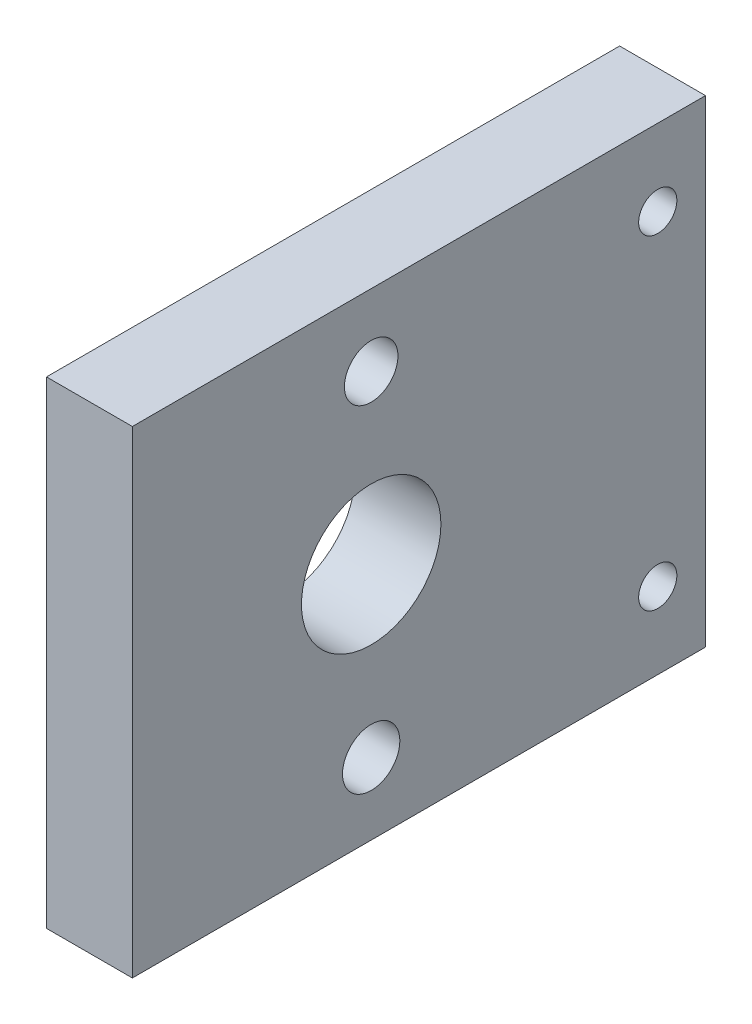
ISO-10303-21;
HEADER;
FILE_DESCRIPTION(('STEP AP214'),'2;1');
FILE_NAME('part.step','',(''),(''),'','','');
FILE_SCHEMA(('AUTOMOTIVE_DESIGN { 1 0 10303 214 1 1 1 1 }'));
ENDSEC;
DATA;
#1=APPLICATION_CONTEXT('core data for automotive mechanical design processes');
#2=APPLICATION_PROTOCOL_DEFINITION('international standard','automotive_design',2000,#1);
#3=PRODUCT_CONTEXT('',#1,'mechanical');
#4=PRODUCT('Part','Part','',(#3));
#5=PRODUCT_RELATED_PRODUCT_CATEGORY('part','',(#4));
#6=PRODUCT_DEFINITION_FORMATION('','',#4);
#7=PRODUCT_DEFINITION_CONTEXT('part definition',#1,'design');
#8=PRODUCT_DEFINITION('design','',#6,#7);
#9=PRODUCT_DEFINITION_SHAPE('','',#8);
#10=(LENGTH_UNIT() NAMED_UNIT(*) SI_UNIT(.MILLI.,.METRE.));
#11=(NAMED_UNIT(*) PLANE_ANGLE_UNIT() SI_UNIT($,.RADIAN.));
#12=(NAMED_UNIT(*) SI_UNIT($,.STERADIAN.) SOLID_ANGLE_UNIT());
#13=UNCERTAINTY_MEASURE_WITH_UNIT(LENGTH_MEASURE(1.E-05),#10,'distance_accuracy_value','');
#14=(GEOMETRIC_REPRESENTATION_CONTEXT(3) GLOBAL_UNCERTAINTY_ASSIGNED_CONTEXT((#13)) GLOBAL_UNIT_ASSIGNED_CONTEXT((#10,
#11,#12)) REPRESENTATION_CONTEXT('',''));
#15=CARTESIAN_POINT('',(0.,0.,0.));
#16=DIRECTION('',(0.,0.,1.));
#17=DIRECTION('',(1.,0.,0.));
#18=AXIS2_PLACEMENT_3D('',#15,#16,#17);
#19=CARTESIAN_POINT('',(-52.810925728328,50.4855029585799,0.));
#20=DIRECTION('',(-1.,0.,0.));
#21=DIRECTION('',(0.,0.,1.));
#22=AXIS2_PLACEMENT_3D('',#19,#20,#21);
#23=PLANE('',#22);
#24=CARTESIAN_POINT('',(-52.810925728328,29.2355029585799,17.5));
#25=DIRECTION('',(-1.,0.,0.));
#26=DIRECTION('',(0.,0.,1.));
#27=AXIS2_PLACEMENT_3D('',#24,#25,#26);
#28=CIRCLE('',#27,1.5);
#29=CARTESIAN_POINT('',(-52.810925728328,29.2355029585799,19.));
#30=VERTEX_POINT('',#29);
#31=EDGE_CURVE('E130',#30,#30,#28,.T.);
#32=ORIENTED_EDGE('',*,*,#31,.F.);
#33=EDGE_LOOP('',(#32));
#34=FACE_BOUND('',#33,.T.);
#35=CARTESIAN_POINT('',(-52.810925728328,46.7355029585799,17.5));
#36=DIRECTION('',(-1.,0.,0.));
#37=DIRECTION('',(0.,0.,1.));
#38=AXIS2_PLACEMENT_3D('',#35,#36,#37);
#39=CIRCLE('',#38,1.4);
#40=CARTESIAN_POINT('',(-52.810925728328,46.7355029585799,18.9));
#41=VERTEX_POINT('',#40);
#42=EDGE_CURVE('E119',#41,#41,#39,.T.);
#43=ORIENTED_EDGE('',*,*,#42,.F.);
#44=EDGE_LOOP('',(#43));
#45=FACE_BOUND('',#44,.T.);
#46=CARTESIAN_POINT('',(-52.810925728328,37.9855029585799,17.5));
#47=DIRECTION('',(-1.,0.,0.));
#48=DIRECTION('',(0.,0.,1.));
#49=AXIS2_PLACEMENT_3D('',#46,#47,#48);
#50=CIRCLE('',#49,3.65);
#51=CARTESIAN_POINT('',(-52.810925728328,37.9855029585799,21.15));
#52=VERTEX_POINT('',#51);
#53=EDGE_CURVE('E123',#52,#52,#50,.T.);
#54=ORIENTED_EDGE('',*,*,#53,.F.);
#55=EDGE_LOOP('',(#54));
#56=FACE_BOUND('',#55,.T.);
#57=CARTESIAN_POINT('',(-52.810925728328,29.4855029585799,2.5));
#58=DIRECTION('',(-1.,0.,0.));
#59=DIRECTION('',(0.,0.,1.));
#60=AXIS2_PLACEMENT_3D('',#57,#58,#59);
#61=CIRCLE('',#60,1.);
#62=CARTESIAN_POINT('',(-52.810925728328,29.4855029585799,3.5));
#63=VERTEX_POINT('',#62);
#64=EDGE_CURVE('E115',#63,#63,#61,.T.);
#65=ORIENTED_EDGE('',*,*,#64,.F.);
#66=EDGE_LOOP('',(#65));
#67=FACE_BOUND('',#66,.T.);
#68=CARTESIAN_POINT('',(-52.810925728328,46.4855029585799,2.5));
#69=DIRECTION('',(-1.,0.,0.));
#70=DIRECTION('',(0.,0.,1.));
#71=AXIS2_PLACEMENT_3D('',#68,#69,#70);
#72=CIRCLE('',#71,1.);
#73=CARTESIAN_POINT('',(-52.810925728328,46.4855029585799,3.5));
#74=VERTEX_POINT('',#73);
#75=EDGE_CURVE('E98',#74,#74,#72,.T.);
#76=ORIENTED_EDGE('',*,*,#75,.F.);
#77=EDGE_LOOP('',(#76));
#78=FACE_BOUND('',#77,.T.);
#79=DIRECTION('',(0.,0.,1.));
#80=VECTOR('',#79,1.);
#81=CARTESIAN_POINT('',(-52.810925728328,25.4855029585799,0.));
#82=LINE('',#81,#80);
#83=CARTESIAN_POINT('',(-52.810925728328,25.4855029585799,0.));
#84=VERTEX_POINT('',#83);
#85=CARTESIAN_POINT('',(-52.810925728328,25.4855029585799,30.));
#86=VERTEX_POINT('',#85);
#87=EDGE_CURVE('E73',#84,#86,#82,.T.);
#88=ORIENTED_EDGE('',*,*,#87,.T.);
#89=DIRECTION('',(0.,-1.,0.));
#90=VECTOR('',#89,1.);
#91=CARTESIAN_POINT('',(-52.810925728328,50.4855029585799,30.));
#92=LINE('',#91,#90);
#93=CARTESIAN_POINT('',(-52.810925728328,50.4855029585799,30.));
#94=VERTEX_POINT('',#93);
#95=EDGE_CURVE('E76',#94,#86,#92,.T.);
#96=ORIENTED_EDGE('',*,*,#95,.F.);
#97=DIRECTION('',(0.,0.,1.));
#98=VECTOR('',#97,1.);
#99=CARTESIAN_POINT('',(-52.810925728328,50.4855029585799,0.));
#100=LINE('',#99,#98);
#101=CARTESIAN_POINT('',(-52.810925728328,50.4855029585799,0.));
#102=VERTEX_POINT('',#101);
#103=EDGE_CURVE('E11',#102,#94,#100,.T.);
#104=ORIENTED_EDGE('',*,*,#103,.F.);
#105=DIRECTION('',(0.,-1.,0.));
#106=VECTOR('',#105,1.);
#107=CARTESIAN_POINT('',(-52.810925728328,50.4855029585799,0.));
#108=LINE('',#107,#106);
#109=EDGE_CURVE('E77',#102,#84,#108,.T.);
#110=ORIENTED_EDGE('',*,*,#109,.T.);
#111=EDGE_LOOP('',(#88,#96,#104,#110));
#112=FACE_BOUND('',#111,.T.);
#113=ADVANCED_FACE('F35',(#34,#45,#56,#67,#78,#112),#23,.T.);
#114=CARTESIAN_POINT('',(-52.810925728328,50.4855029585799,0.));
#115=DIRECTION('',(0.,1.,0.));
#116=DIRECTION('',(0.,0.,1.));
#117=AXIS2_PLACEMENT_3D('',#114,#115,#116);
#118=PLANE('',#117);
#119=ORIENTED_EDGE('',*,*,#103,.T.);
#120=DIRECTION('',(-1.,0.,0.));
#121=VECTOR('',#120,1.);
#122=CARTESIAN_POINT('',(-52.810925728328,50.4855029585799,30.));
#123=LINE('',#122,#121);
#124=CARTESIAN_POINT('',(-48.3154315939984,50.4855029585799,30.));
#125=VERTEX_POINT('',#124);
#126=EDGE_CURVE('E94',#125,#94,#123,.T.);
#127=ORIENTED_EDGE('',*,*,#126,.F.);
#128=DIRECTION('',(0.,0.,1.));
#129=VECTOR('',#128,1.);
#130=CARTESIAN_POINT('',(-48.3154315939984,50.4855029585799,0.));
#131=LINE('',#130,#129);
#132=CARTESIAN_POINT('',(-48.3154315939984,50.4855029585799,0.));
#133=VERTEX_POINT('',#132);
#134=EDGE_CURVE('E43',#133,#125,#131,.T.);
#135=ORIENTED_EDGE('',*,*,#134,.F.);
#136=DIRECTION('',(-1.,0.,0.));
#137=VECTOR('',#136,1.);
#138=CARTESIAN_POINT('',(-52.810925728328,50.4855029585799,0.));
#139=LINE('',#138,#137);
#140=EDGE_CURVE('E82',#133,#102,#139,.T.);
#141=ORIENTED_EDGE('',*,*,#140,.T.);
#142=EDGE_LOOP('',(#119,#127,#135,#141));
#143=FACE_BOUND('',#142,.T.);
#144=ADVANCED_FACE('F141',(#143),#118,.T.);
#145=CARTESIAN_POINT('',(-48.3154315939984,50.4855029585799,0.));
#146=DIRECTION('',(1.,0.,0.));
#147=DIRECTION('',(0.,0.,-1.));
#148=AXIS2_PLACEMENT_3D('',#145,#146,#147);
#149=PLANE('',#148);
#150=CARTESIAN_POINT('',(-48.3154315939984,29.2355029585799,17.5));
#151=DIRECTION('',(1.,0.,0.));
#152=DIRECTION('',(0.,0.,-1.));
#153=AXIS2_PLACEMENT_3D('',#150,#151,#152);
#154=CIRCLE('',#153,1.5);
#155=CARTESIAN_POINT('',(-48.3154315939984,29.2355029585799,16.));
#156=VERTEX_POINT('',#155);
#157=EDGE_CURVE('E38',#156,#156,#154,.T.);
#158=ORIENTED_EDGE('',*,*,#157,.F.);
#159=EDGE_LOOP('',(#158));
#160=FACE_BOUND('',#159,.T.);
#161=CARTESIAN_POINT('',(-48.3154315939984,46.7355029585799,17.5));
#162=DIRECTION('',(1.,0.,0.));
#163=DIRECTION('',(0.,0.,-1.));
#164=AXIS2_PLACEMENT_3D('',#161,#162,#163);
#165=CIRCLE('',#164,1.4);
#166=CARTESIAN_POINT('',(-48.3154315939984,46.7355029585799,16.1));
#167=VERTEX_POINT('',#166);
#168=EDGE_CURVE('E116',#167,#167,#165,.T.);
#169=ORIENTED_EDGE('',*,*,#168,.F.);
#170=EDGE_LOOP('',(#169));
#171=FACE_BOUND('',#170,.T.);
#172=CARTESIAN_POINT('',(-48.3154315939984,37.9855029585799,17.5));
#173=DIRECTION('',(1.,0.,0.));
#174=DIRECTION('',(0.,0.,-1.));
#175=AXIS2_PLACEMENT_3D('',#172,#173,#174);
#176=CIRCLE('',#175,3.65);
#177=CARTESIAN_POINT('',(-48.3154315939984,37.9855029585799,13.85));
#178=VERTEX_POINT('',#177);
#179=EDGE_CURVE('E118',#178,#178,#176,.T.);
#180=ORIENTED_EDGE('',*,*,#179,.F.);
#181=EDGE_LOOP('',(#180));
#182=FACE_BOUND('',#181,.T.);
#183=CARTESIAN_POINT('',(-48.3154315939984,29.4855029585799,2.5));
#184=DIRECTION('',(1.,0.,0.));
#185=DIRECTION('',(0.,0.,-1.));
#186=AXIS2_PLACEMENT_3D('',#183,#184,#185);
#187=CIRCLE('',#186,1.);
#188=CARTESIAN_POINT('',(-48.3154315939984,29.4855029585799,1.5));
#189=VERTEX_POINT('',#188);
#190=EDGE_CURVE('E113',#189,#189,#187,.T.);
#191=ORIENTED_EDGE('',*,*,#190,.F.);
#192=EDGE_LOOP('',(#191));
#193=FACE_BOUND('',#192,.T.);
#194=CARTESIAN_POINT('',(-48.3154315939984,46.4855029585799,2.5));
#195=DIRECTION('',(1.,0.,0.));
#196=DIRECTION('',(0.,0.,-1.));
#197=AXIS2_PLACEMENT_3D('',#194,#195,#196);
#198=CIRCLE('',#197,1.);
#199=CARTESIAN_POINT('',(-48.3154315939984,46.4855029585799,1.5));
#200=VERTEX_POINT('',#199);
#201=EDGE_CURVE('E95',#200,#200,#198,.T.);
#202=ORIENTED_EDGE('',*,*,#201,.F.);
#203=EDGE_LOOP('',(#202));
#204=FACE_BOUND('',#203,.T.);
#205=ORIENTED_EDGE('',*,*,#134,.T.);
#206=DIRECTION('',(0.,1.,0.));
#207=VECTOR('',#206,1.);
#208=CARTESIAN_POINT('',(-48.3154315939984,50.4855029585799,30.));
#209=LINE('',#208,#207);
#210=CARTESIAN_POINT('',(-48.3154315939984,25.4855029585799,30.));
#211=VERTEX_POINT('',#210);
#212=EDGE_CURVE('E90',#211,#125,#209,.T.);
#213=ORIENTED_EDGE('',*,*,#212,.F.);
#214=DIRECTION('',(0.,0.,1.));
#215=VECTOR('',#214,1.);
#216=CARTESIAN_POINT('',(-48.3154315939984,25.4855029585799,0.));
#217=LINE('',#216,#215);
#218=CARTESIAN_POINT('',(-48.3154315939984,25.4855029585799,0.));
#219=VERTEX_POINT('',#218);
#220=EDGE_CURVE('E81',#219,#211,#217,.T.);
#221=ORIENTED_EDGE('',*,*,#220,.F.);
#222=DIRECTION('',(0.,1.,0.));
#223=VECTOR('',#222,1.);
#224=CARTESIAN_POINT('',(-48.3154315939984,50.4855029585799,0.));
#225=LINE('',#224,#223);
#226=EDGE_CURVE('E108',#219,#133,#225,.T.);
#227=ORIENTED_EDGE('',*,*,#226,.T.);
#228=EDGE_LOOP('',(#205,#213,#221,#227));
#229=FACE_BOUND('',#228,.T.);
#230=ADVANCED_FACE('F166',(#160,#171,#182,#193,#204,#229),#149,.T.);
#231=CARTESIAN_POINT('',(-52.810925728328,25.4855029585799,0.));
#232=DIRECTION('',(0.,-1.,0.));
#233=DIRECTION('',(0.,0.,-1.));
#234=AXIS2_PLACEMENT_3D('',#231,#232,#233);
#235=PLANE('',#234);
#236=ORIENTED_EDGE('',*,*,#220,.T.);
#237=DIRECTION('',(1.,0.,0.));
#238=VECTOR('',#237,1.);
#239=CARTESIAN_POINT('',(-52.810925728328,25.4855029585799,30.));
#240=LINE('',#239,#238);
#241=EDGE_CURVE('E85',#86,#211,#240,.T.);
#242=ORIENTED_EDGE('',*,*,#241,.F.);
#243=ORIENTED_EDGE('',*,*,#87,.F.);
#244=DIRECTION('',(1.,0.,0.));
#245=VECTOR('',#244,1.);
#246=CARTESIAN_POINT('',(-52.810925728328,25.4855029585799,0.));
#247=LINE('',#246,#245);
#248=EDGE_CURVE('E106',#84,#219,#247,.T.);
#249=ORIENTED_EDGE('',*,*,#248,.T.);
#250=EDGE_LOOP('',(#236,#242,#243,#249));
#251=FACE_BOUND('',#250,.T.);
#252=ADVANCED_FACE('F86',(#251),#235,.T.);
#253=CARTESIAN_POINT('',(0.,0.,0.));
#254=DIRECTION('',(0.,0.,1.));
#255=DIRECTION('',(1.,0.,0.));
#256=AXIS2_PLACEMENT_3D('',#253,#254,#255);
#257=PLANE('',#256);
#258=ORIENTED_EDGE('',*,*,#109,.F.);
#259=ORIENTED_EDGE('',*,*,#140,.F.);
#260=ORIENTED_EDGE('',*,*,#226,.F.);
#261=ORIENTED_EDGE('',*,*,#248,.F.);
#262=EDGE_LOOP('',(#258,#259,#260,#261));
#263=FACE_BOUND('',#262,.T.);
#264=ADVANCED_FACE('F157',(#263),#257,.F.);
#265=CARTESIAN_POINT('',(0.,0.,30.));
#266=DIRECTION('',(0.,0.,1.));
#267=DIRECTION('',(1.,0.,0.));
#268=AXIS2_PLACEMENT_3D('',#265,#266,#267);
#269=PLANE('',#268);
#270=ORIENTED_EDGE('',*,*,#95,.T.);
#271=ORIENTED_EDGE('',*,*,#241,.T.);
#272=ORIENTED_EDGE('',*,*,#212,.T.);
#273=ORIENTED_EDGE('',*,*,#126,.T.);
#274=EDGE_LOOP('',(#270,#271,#272,#273));
#275=FACE_BOUND('',#274,.T.);
#276=ADVANCED_FACE('F93',(#275),#269,.T.);
#277=CARTESIAN_POINT('',(-42.810925728328,46.4855029585799,2.5));
#278=DIRECTION('',(-1.,0.,0.));
#279=DIRECTION('',(0.,0.,1.));
#280=AXIS2_PLACEMENT_3D('',#277,#278,#279);
#281=CYLINDRICAL_SURFACE('',#280,1.);
#282=ORIENTED_EDGE('',*,*,#201,.T.);
#283=EDGE_LOOP('',(#282));
#284=FACE_BOUND('',#283,.T.);
#285=ORIENTED_EDGE('',*,*,#75,.T.);
#286=EDGE_LOOP('',(#285));
#287=FACE_BOUND('',#286,.T.);
#288=ADVANCED_FACE('F146',(#284,#287),#281,.F.);
#289=CARTESIAN_POINT('',(-42.810925728328,29.4855029585799,2.5));
#290=DIRECTION('',(-1.,0.,0.));
#291=DIRECTION('',(0.,0.,1.));
#292=AXIS2_PLACEMENT_3D('',#289,#290,#291);
#293=CYLINDRICAL_SURFACE('',#292,1.);
#294=ORIENTED_EDGE('',*,*,#190,.T.);
#295=EDGE_LOOP('',(#294));
#296=FACE_BOUND('',#295,.T.);
#297=ORIENTED_EDGE('',*,*,#64,.T.);
#298=EDGE_LOOP('',(#297));
#299=FACE_BOUND('',#298,.T.);
#300=ADVANCED_FACE('F137',(#296,#299),#293,.F.);
#301=CARTESIAN_POINT('',(-58.3154315939984,37.9855029585799,17.5));
#302=DIRECTION('',(1.,0.,0.));
#303=DIRECTION('',(0.,0.,-1.));
#304=AXIS2_PLACEMENT_3D('',#301,#302,#303);
#305=CYLINDRICAL_SURFACE('',#304,3.65);
#306=ORIENTED_EDGE('',*,*,#53,.T.);
#307=EDGE_LOOP('',(#306));
#308=FACE_BOUND('',#307,.T.);
#309=ORIENTED_EDGE('',*,*,#179,.T.);
#310=EDGE_LOOP('',(#309));
#311=FACE_BOUND('',#310,.T.);
#312=ADVANCED_FACE('F154',(#308,#311),#305,.F.);
#313=CARTESIAN_POINT('',(-42.810925728328,46.7355029585799,17.5));
#314=DIRECTION('',(-1.,0.,0.));
#315=DIRECTION('',(0.,0.,1.));
#316=AXIS2_PLACEMENT_3D('',#313,#314,#315);
#317=CYLINDRICAL_SURFACE('',#316,1.4);
#318=ORIENTED_EDGE('',*,*,#168,.T.);
#319=EDGE_LOOP('',(#318));
#320=FACE_BOUND('',#319,.T.);
#321=ORIENTED_EDGE('',*,*,#42,.T.);
#322=EDGE_LOOP('',(#321));
#323=FACE_BOUND('',#322,.T.);
#324=ADVANCED_FACE('F202',(#320,#323),#317,.F.);
#325=CARTESIAN_POINT('',(-42.810925728328,29.2355029585799,17.5));
#326=DIRECTION('',(-1.,0.,0.));
#327=DIRECTION('',(0.,0.,1.));
#328=AXIS2_PLACEMENT_3D('',#325,#326,#327);
#329=CYLINDRICAL_SURFACE('',#328,1.5);
#330=ORIENTED_EDGE('',*,*,#157,.T.);
#331=EDGE_LOOP('',(#330));
#332=FACE_BOUND('',#331,.T.);
#333=ORIENTED_EDGE('',*,*,#31,.T.);
#334=EDGE_LOOP('',(#333));
#335=FACE_BOUND('',#334,.T.);
#336=ADVANCED_FACE('F211',(#332,#335),#329,.F.);
#337=CLOSED_SHELL('',(#113,#144,#230,#252,#264,#276,#288,#300,#312,#324,#336));
#338=MANIFOLD_SOLID_BREP('B2',#337);
#339=ADVANCED_BREP_SHAPE_REPRESENTATION('',(#18,#338),#14);
#340=SHAPE_DEFINITION_REPRESENTATION(#9,#339);
ENDSEC;
END-ISO-10303-21;
